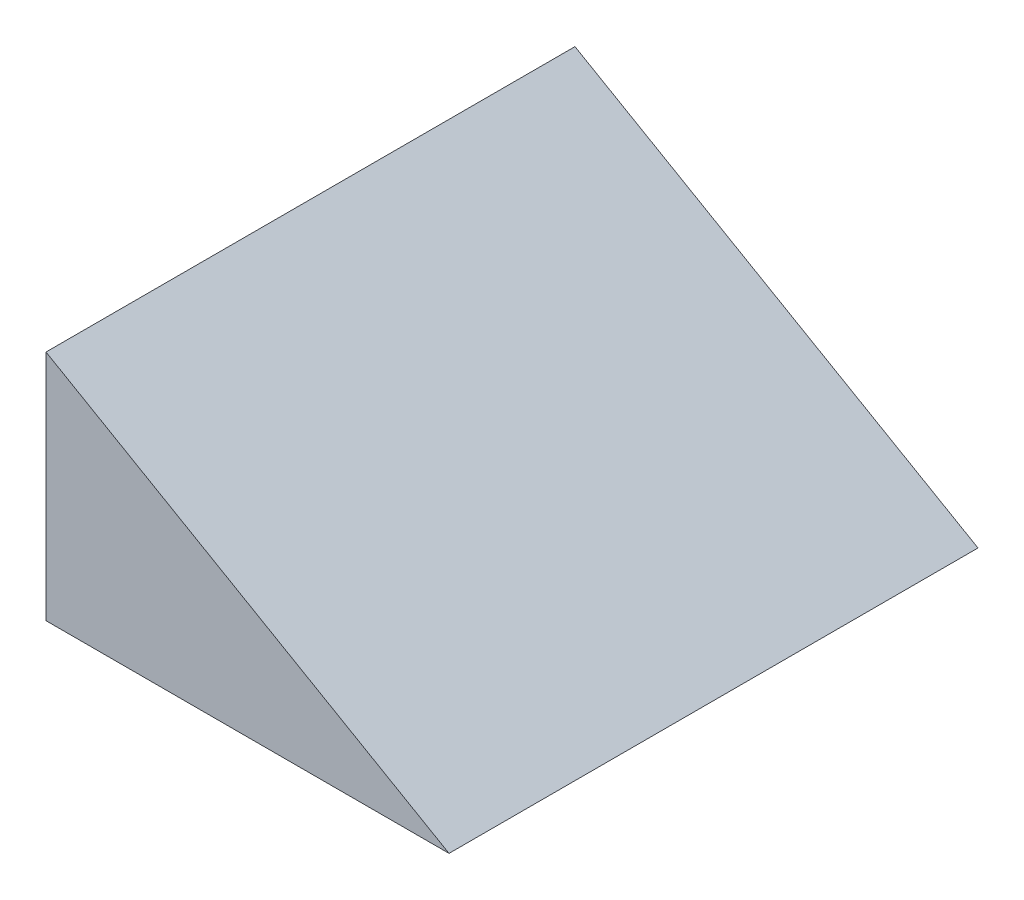
ISO-10303-21;
HEADER;
FILE_DESCRIPTION(('STEP AP214'),'2;1');
FILE_NAME('part.step','',(''),(''),'','','');
FILE_SCHEMA(('AUTOMOTIVE_DESIGN { 1 0 10303 214 1 1 1 1 }'));
ENDSEC;
DATA;
#1=APPLICATION_CONTEXT('core data for automotive mechanical design processes');
#2=APPLICATION_PROTOCOL_DEFINITION('international standard','automotive_design',2000,#1);
#3=PRODUCT_CONTEXT('',#1,'mechanical');
#4=PRODUCT('Part','Part','',(#3));
#5=PRODUCT_RELATED_PRODUCT_CATEGORY('part','',(#4));
#6=PRODUCT_DEFINITION_FORMATION('','',#4);
#7=PRODUCT_DEFINITION_CONTEXT('part definition',#1,'design');
#8=PRODUCT_DEFINITION('design','',#6,#7);
#9=PRODUCT_DEFINITION_SHAPE('','',#8);
#10=(LENGTH_UNIT() NAMED_UNIT(*) SI_UNIT(.MILLI.,.METRE.));
#11=(NAMED_UNIT(*) PLANE_ANGLE_UNIT() SI_UNIT($,.RADIAN.));
#12=(NAMED_UNIT(*) SI_UNIT($,.STERADIAN.) SOLID_ANGLE_UNIT());
#13=UNCERTAINTY_MEASURE_WITH_UNIT(LENGTH_MEASURE(1.E-05),#10,'distance_accuracy_value','');
#14=(GEOMETRIC_REPRESENTATION_CONTEXT(3) GLOBAL_UNCERTAINTY_ASSIGNED_CONTEXT((#13)) GLOBAL_UNIT_ASSIGNED_CONTEXT((#10,
#11,#12)) REPRESENTATION_CONTEXT('',''));
#15=CARTESIAN_POINT('',(0.,0.,0.));
#16=DIRECTION('',(0.,0.,1.));
#17=DIRECTION('',(1.,0.,0.));
#18=AXIS2_PLACEMENT_3D('',#15,#16,#17);
#19=CARTESIAN_POINT('',(0.,0.,21.));
#20=DIRECTION('',(0.,1.,0.));
#21=DIRECTION('',(0.,0.,1.));
#22=AXIS2_PLACEMENT_3D('',#19,#20,#21);
#23=PLANE('',#22);
#24=DIRECTION('',(1.,0.,0.));
#25=VECTOR('',#24,1.);
#26=CARTESIAN_POINT('',(0.,0.,0.));
#27=LINE('',#26,#25);
#28=CARTESIAN_POINT('',(0.,0.,0.));
#29=VERTEX_POINT('',#28);
#30=CARTESIAN_POINT('',(16.,0.,0.));
#31=VERTEX_POINT('',#30);
#32=EDGE_CURVE('E78',#29,#31,#27,.T.);
#33=ORIENTED_EDGE('',*,*,#32,.T.);
#34=DIRECTION('',(0.,0.,-1.));
#35=VECTOR('',#34,1.);
#36=CARTESIAN_POINT('',(16.,0.,21.));
#37=LINE('',#36,#35);
#38=CARTESIAN_POINT('',(16.,0.,21.));
#39=VERTEX_POINT('',#38);
#40=EDGE_CURVE('E11',#39,#31,#37,.T.);
#41=ORIENTED_EDGE('',*,*,#40,.F.);
#42=DIRECTION('',(1.,0.,0.));
#43=VECTOR('',#42,1.);
#44=CARTESIAN_POINT('',(0.,0.,21.));
#45=LINE('',#44,#43);
#46=CARTESIAN_POINT('',(0.,0.,21.));
#47=VERTEX_POINT('',#46);
#48=EDGE_CURVE('E73',#47,#39,#45,.T.);
#49=ORIENTED_EDGE('',*,*,#48,.F.);
#50=DIRECTION('',(0.,0.,-1.));
#51=VECTOR('',#50,1.);
#52=CARTESIAN_POINT('',(0.,0.,21.));
#53=LINE('',#52,#51);
#54=EDGE_CURVE('E48',#47,#29,#53,.T.);
#55=ORIENTED_EDGE('',*,*,#54,.T.);
#56=EDGE_LOOP('',(#33,#41,#49,#55));
#57=FACE_BOUND('',#56,.T.);
#58=ADVANCED_FACE('F32',(#57),#23,.F.);
#59=CARTESIAN_POINT('',(16.,0.,21.));
#60=DIRECTION('',(-0.5,-0.866025403784439,0.));
#61=DIRECTION('',(0.866025403784439,-0.5,0.));
#62=AXIS2_PLACEMENT_3D('',#59,#60,#61);
#63=PLANE('',#62);
#64=DIRECTION('',(-0.866025403784439,0.5,0.));
#65=VECTOR('',#64,1.);
#66=CARTESIAN_POINT('',(16.,0.,0.));
#67=LINE('',#66,#65);
#68=CARTESIAN_POINT('',(0.,9.23760430703401,0.));
#69=VERTEX_POINT('',#68);
#70=EDGE_CURVE('E81',#31,#69,#67,.T.);
#71=ORIENTED_EDGE('',*,*,#70,.T.);
#72=DIRECTION('',(0.,0.,-1.));
#73=VECTOR('',#72,1.);
#74=CARTESIAN_POINT('',(0.,9.23760430703401,21.));
#75=LINE('',#74,#73);
#76=CARTESIAN_POINT('',(0.,9.23760430703401,21.));
#77=VERTEX_POINT('',#76);
#78=EDGE_CURVE('E40',#77,#69,#75,.T.);
#79=ORIENTED_EDGE('',*,*,#78,.F.);
#80=DIRECTION('',(-0.866025403784439,0.5,0.));
#81=VECTOR('',#80,1.);
#82=CARTESIAN_POINT('',(16.,0.,21.));
#83=LINE('',#82,#81);
#84=EDGE_CURVE('E66',#39,#77,#83,.T.);
#85=ORIENTED_EDGE('',*,*,#84,.F.);
#86=ORIENTED_EDGE('',*,*,#40,.T.);
#87=EDGE_LOOP('',(#71,#79,#85,#86));
#88=FACE_BOUND('',#87,.T.);
#89=ADVANCED_FACE('F68',(#88),#63,.F.);
#90=CARTESIAN_POINT('',(0.,0.,21.));
#91=DIRECTION('',(-1.,0.,0.));
#92=DIRECTION('',(0.,0.,1.));
#93=AXIS2_PLACEMENT_3D('',#90,#91,#92);
#94=PLANE('',#93);
#95=DIRECTION('',(0.,1.,0.));
#96=VECTOR('',#95,1.);
#97=CARTESIAN_POINT('',(0.,0.,0.));
#98=LINE('',#97,#96);
#99=EDGE_CURVE('E76',#29,#69,#98,.T.);
#100=ORIENTED_EDGE('',*,*,#99,.F.);
#101=ORIENTED_EDGE('',*,*,#54,.F.);
#102=DIRECTION('',(0.,1.,0.));
#103=VECTOR('',#102,1.);
#104=CARTESIAN_POINT('',(0.,0.,21.));
#105=LINE('',#104,#103);
#106=EDGE_CURVE('E72',#47,#77,#105,.T.);
#107=ORIENTED_EDGE('',*,*,#106,.T.);
#108=ORIENTED_EDGE('',*,*,#78,.T.);
#109=EDGE_LOOP('',(#100,#101,#107,#108));
#110=FACE_BOUND('',#109,.T.);
#111=ADVANCED_FACE('F87',(#110),#94,.T.);
#112=CARTESIAN_POINT('',(0.,0.,21.));
#113=DIRECTION('',(0.,0.,1.));
#114=DIRECTION('',(1.,0.,0.));
#115=AXIS2_PLACEMENT_3D('',#112,#113,#114);
#116=PLANE('',#115);
#117=ORIENTED_EDGE('',*,*,#48,.T.);
#118=ORIENTED_EDGE('',*,*,#84,.T.);
#119=ORIENTED_EDGE('',*,*,#106,.F.);
#120=EDGE_LOOP('',(#117,#118,#119));
#121=FACE_BOUND('',#120,.T.);
#122=ADVANCED_FACE('F75',(#121),#116,.T.);
#123=CARTESIAN_POINT('',(0.,0.,0.));
#124=DIRECTION('',(0.,0.,1.));
#125=DIRECTION('',(1.,0.,0.));
#126=AXIS2_PLACEMENT_3D('',#123,#124,#125);
#127=PLANE('',#126);
#128=ORIENTED_EDGE('',*,*,#32,.F.);
#129=ORIENTED_EDGE('',*,*,#99,.T.);
#130=ORIENTED_EDGE('',*,*,#70,.F.);
#131=EDGE_LOOP('',(#128,#129,#130));
#132=FACE_BOUND('',#131,.T.);
#133=ADVANCED_FACE('F94',(#132),#127,.F.);
#134=CLOSED_SHELL('',(#58,#89,#111,#122,#133));
#135=MANIFOLD_SOLID_BREP('B2',#134);
#136=ADVANCED_BREP_SHAPE_REPRESENTATION('',(#18,#135),#14);
#137=SHAPE_DEFINITION_REPRESENTATION(#9,#136);
ENDSEC;
END-ISO-10303-21;
